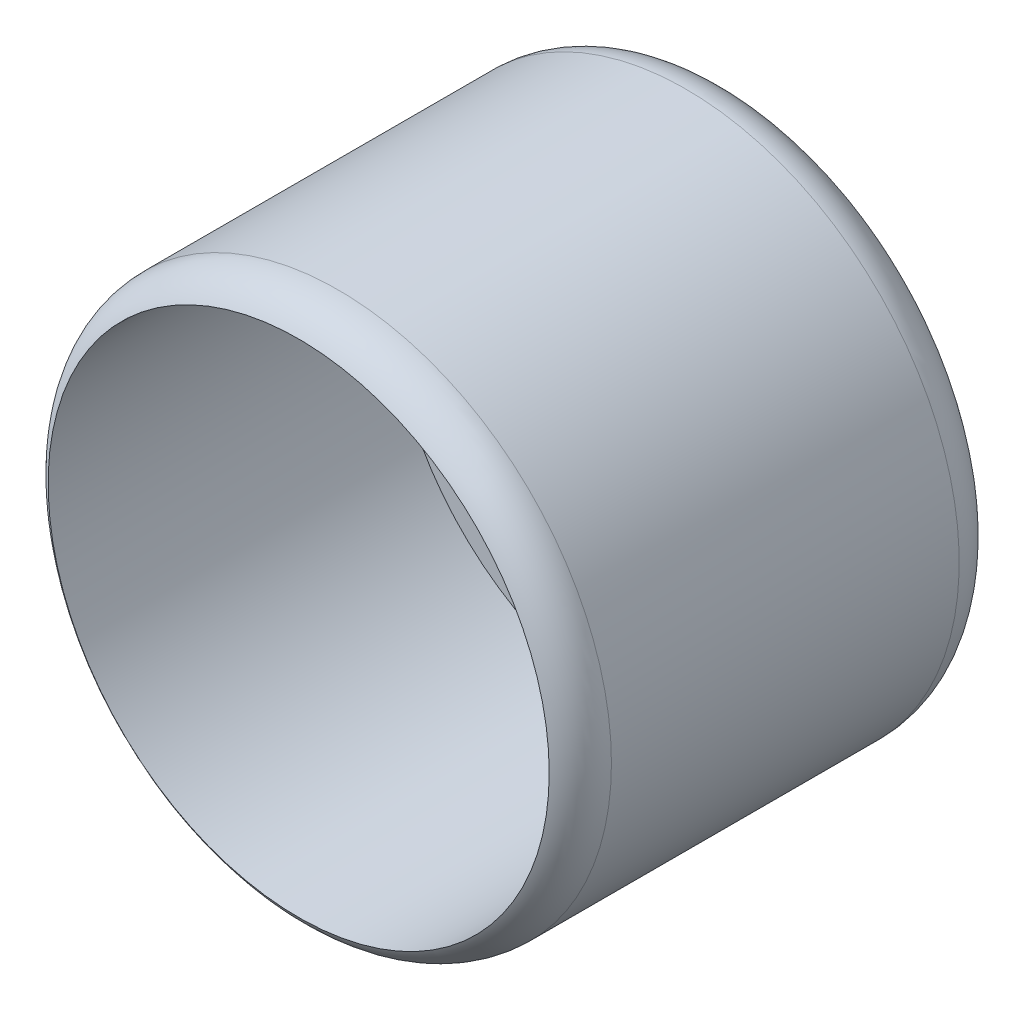
ISO-10303-21;
HEADER;
FILE_DESCRIPTION(('STEP AP214'),'2;1');
FILE_NAME('part.step','',(''),(''),'','','');
FILE_SCHEMA(('AUTOMOTIVE_DESIGN { 1 0 10303 214 1 1 1 1 }'));
ENDSEC;
DATA;
#1=APPLICATION_CONTEXT('core data for automotive mechanical design processes');
#2=APPLICATION_PROTOCOL_DEFINITION('international standard','automotive_design',2000,#1);
#3=PRODUCT_CONTEXT('',#1,'mechanical');
#4=PRODUCT('Part','Part','',(#3));
#5=PRODUCT_RELATED_PRODUCT_CATEGORY('part','',(#4));
#6=PRODUCT_DEFINITION_FORMATION('','',#4);
#7=PRODUCT_DEFINITION_CONTEXT('part definition',#1,'design');
#8=PRODUCT_DEFINITION('design','',#6,#7);
#9=PRODUCT_DEFINITION_SHAPE('','',#8);
#10=(LENGTH_UNIT() NAMED_UNIT(*) SI_UNIT(.MILLI.,.METRE.));
#11=(NAMED_UNIT(*) PLANE_ANGLE_UNIT() SI_UNIT($,.RADIAN.));
#12=(NAMED_UNIT(*) SI_UNIT($,.STERADIAN.) SOLID_ANGLE_UNIT());
#13=UNCERTAINTY_MEASURE_WITH_UNIT(LENGTH_MEASURE(1.E-05),#10,'distance_accuracy_value','');
#14=(GEOMETRIC_REPRESENTATION_CONTEXT(3) GLOBAL_UNCERTAINTY_ASSIGNED_CONTEXT((#13)) GLOBAL_UNIT_ASSIGNED_CONTEXT((#10,
#11,#12)) REPRESENTATION_CONTEXT('',''));
#15=CARTESIAN_POINT('',(0.,0.,0.));
#16=DIRECTION('',(0.,0.,1.));
#17=DIRECTION('',(1.,0.,0.));
#18=AXIS2_PLACEMENT_3D('',#15,#16,#17);
#19=CARTESIAN_POINT('',(0.,0.,-26.2311815808494));
#20=DIRECTION('',(0.,0.,-1.));
#21=DIRECTION('',(-1.,0.,0.));
#22=AXIS2_PLACEMENT_3D('',#19,#20,#21);
#23=CYLINDRICAL_SURFACE('',#22,4.375);
#24=CARTESIAN_POINT('',(0.,0.,-43.605550251614));
#25=DIRECTION('',(0.,0.,-1.));
#26=DIRECTION('',(-1.,0.,0.));
#27=AXIS2_PLACEMENT_3D('',#24,#25,#26);
#28=CIRCLE('',#27,4.375);
#29=CARTESIAN_POINT('',(-4.375,0.,-43.605550251614));
#30=VERTEX_POINT('',#29);
#31=EDGE_CURVE('E54',#30,#30,#28,.T.);
#32=ORIENTED_EDGE('',*,*,#31,.T.);
#33=EDGE_LOOP('',(#32));
#34=FACE_BOUND('',#33,.T.);
#35=CARTESIAN_POINT('',(0.,0.,-38.855550251614));
#36=DIRECTION('',(0.,0.,1.));
#37=DIRECTION('',(1.,0.,0.));
#38=AXIS2_PLACEMENT_3D('',#35,#36,#37);
#39=CIRCLE('',#38,4.375);
#40=CARTESIAN_POINT('',(4.37500000000001,0.,-38.855550251614));
#41=VERTEX_POINT('',#40);
#42=EDGE_CURVE('E51',#41,#41,#39,.F.);
#43=ORIENTED_EDGE('',*,*,#42,.F.);
#44=EDGE_LOOP('',(#43));
#45=FACE_BOUND('',#44,.T.);
#46=ADVANCED_FACE('F33',(#34,#45),#23,.F.);
#47=CARTESIAN_POINT('',(0.,0.,-19.855550251614));
#48=DIRECTION('',(0.,0.,-1.));
#49=DIRECTION('',(-1.,0.,0.));
#50=AXIS2_PLACEMENT_3D('',#47,#48,#49);
#51=CYLINDRICAL_SURFACE('',#50,15.);
#52=CARTESIAN_POINT('',(0.,0.,-22.0206137610751));
#53=DIRECTION('',(0.,0.,1.));
#54=DIRECTION('',(1.,0.,0.));
#55=AXIS2_PLACEMENT_3D('',#52,#53,#54);
#56=CIRCLE('',#55,15.);
#57=CARTESIAN_POINT('',(15.,0.,-22.0206137610751));
#58=VERTEX_POINT('',#57);
#59=EDGE_CURVE('E10',#58,#58,#56,.F.);
#60=ORIENTED_EDGE('',*,*,#59,.T.);
#61=EDGE_LOOP('',(#60));
#62=FACE_BOUND('',#61,.T.);
#63=CARTESIAN_POINT('',(0.,0.,-41.105550251614));
#64=DIRECTION('',(0.,0.,-1.));
#65=DIRECTION('',(-1.,0.,0.));
#66=AXIS2_PLACEMENT_3D('',#63,#64,#65);
#67=CIRCLE('',#66,15.);
#68=CARTESIAN_POINT('',(-15.,0.,-41.105550251614));
#69=VERTEX_POINT('',#68);
#70=EDGE_CURVE('E40',#69,#69,#67,.F.);
#71=ORIENTED_EDGE('',*,*,#70,.T.);
#72=EDGE_LOOP('',(#71));
#73=FACE_BOUND('',#72,.T.);
#74=ADVANCED_FACE('F88',(#62,#73),#51,.T.);
#75=CARTESIAN_POINT('',(0.,0.,-19.855550251614));
#76=DIRECTION('',(0.,0.,-1.));
#77=DIRECTION('',(-1.,0.,0.));
#78=AXIS2_PLACEMENT_3D('',#75,#76,#77);
#79=CYLINDRICAL_SURFACE('',#78,13.75);
#80=CARTESIAN_POINT('',(0.,0.,-19.855550251614));
#81=DIRECTION('',(0.,0.,1.));
#82=DIRECTION('',(1.,0.,0.));
#83=AXIS2_PLACEMENT_3D('',#80,#81,#82);
#84=CIRCLE('',#83,13.75);
#85=CARTESIAN_POINT('',(13.75,0.,-19.855550251614));
#86=VERTEX_POINT('',#85);
#87=EDGE_CURVE('E48',#86,#86,#84,.T.);
#88=ORIENTED_EDGE('',*,*,#87,.T.);
#89=EDGE_LOOP('',(#88));
#90=FACE_BOUND('',#89,.T.);
#91=CARTESIAN_POINT('',(0.,0.,-38.605550251614));
#92=DIRECTION('',(0.,0.,1.));
#93=DIRECTION('',(1.,0.,0.));
#94=AXIS2_PLACEMENT_3D('',#91,#92,#93);
#95=CIRCLE('',#94,13.75);
#96=CARTESIAN_POINT('',(13.75,0.,-38.605550251614));
#97=VERTEX_POINT('',#96);
#98=EDGE_CURVE('E58',#97,#97,#95,.T.);
#99=ORIENTED_EDGE('',*,*,#98,.F.);
#100=EDGE_LOOP('',(#99));
#101=FACE_BOUND('',#100,.T.);
#102=ADVANCED_FACE('F83',(#90,#101),#79,.F.);
#103=CARTESIAN_POINT('',(0.,0.,-38.605550251614));
#104=DIRECTION('',(0.,0.,1.));
#105=DIRECTION('',(1.,0.,0.));
#106=AXIS2_PLACEMENT_3D('',#103,#104,#105);
#107=PLANE('',#106);
#108=CARTESIAN_POINT('',(0.,0.,-38.605550251614));
#109=DIRECTION('',(0.,0.,1.));
#110=DIRECTION('',(1.,0.,0.));
#111=AXIS2_PLACEMENT_3D('',#108,#109,#110);
#112=CIRCLE('',#111,5.);
#113=CARTESIAN_POINT('',(5.00000000000001,0.,-38.605550251614));
#114=VERTEX_POINT('',#113);
#115=EDGE_CURVE('E63',#114,#114,#112,.T.);
#116=ORIENTED_EDGE('',*,*,#115,.F.);
#117=EDGE_LOOP('',(#116));
#118=FACE_BOUND('',#117,.T.);
#119=ORIENTED_EDGE('',*,*,#98,.T.);
#120=EDGE_LOOP('',(#119));
#121=FACE_BOUND('',#120,.T.);
#122=ADVANCED_FACE('F79',(#118,#121),#107,.T.);
#123=CARTESIAN_POINT('',(0.,0.,-43.605550251614));
#124=DIRECTION('',(0.,0.,-1.));
#125=DIRECTION('',(-1.,0.,0.));
#126=AXIS2_PLACEMENT_3D('',#123,#124,#125);
#127=PLANE('',#126);
#128=CARTESIAN_POINT('',(0.,0.,-43.605550251614));
#129=DIRECTION('',(0.,0.,-1.));
#130=DIRECTION('',(-1.,0.,0.));
#131=AXIS2_PLACEMENT_3D('',#128,#129,#130);
#132=CIRCLE('',#131,12.5);
#133=CARTESIAN_POINT('',(-12.5,0.,-43.605550251614));
#134=VERTEX_POINT('',#133);
#135=EDGE_CURVE('E44',#134,#134,#132,.T.);
#136=ORIENTED_EDGE('',*,*,#135,.T.);
#137=EDGE_LOOP('',(#136));
#138=FACE_BOUND('',#137,.T.);
#139=ORIENTED_EDGE('',*,*,#31,.F.);
#140=EDGE_LOOP('',(#139));
#141=FACE_BOUND('',#140,.T.);
#142=ADVANCED_FACE('F82',(#138,#141),#127,.T.);
#143=CARTESIAN_POINT('',(0.,0.,-38.855550251614));
#144=DIRECTION('',(0.,0.,1.));
#145=DIRECTION('',(1.,0.,0.));
#146=AXIS2_PLACEMENT_3D('',#143,#144,#145);
#147=PLANE('',#146);
#148=CARTESIAN_POINT('',(0.,0.,-38.855550251614));
#149=DIRECTION('',(0.,0.,1.));
#150=DIRECTION('',(1.,0.,0.));
#151=AXIS2_PLACEMENT_3D('',#148,#149,#150);
#152=CIRCLE('',#151,5.);
#153=CARTESIAN_POINT('',(5.00000000000001,0.,-38.855550251614));
#154=VERTEX_POINT('',#153);
#155=EDGE_CURVE('E55',#154,#154,#152,.T.);
#156=ORIENTED_EDGE('',*,*,#155,.T.);
#157=EDGE_LOOP('',(#156));
#158=FACE_BOUND('',#157,.T.);
#159=ORIENTED_EDGE('',*,*,#42,.T.);
#160=EDGE_LOOP('',(#159));
#161=FACE_BOUND('',#160,.T.);
#162=ADVANCED_FACE('F69',(#158,#161),#147,.T.);
#163=CARTESIAN_POINT('',(0.,0.,-38.855550251614));
#164=DIRECTION('',(0.,0.,1.));
#165=DIRECTION('',(1.,0.,0.));
#166=AXIS2_PLACEMENT_3D('',#163,#164,#165);
#167=CYLINDRICAL_SURFACE('',#166,5.);
#168=ORIENTED_EDGE('',*,*,#155,.F.);
#169=EDGE_LOOP('',(#168));
#170=FACE_BOUND('',#169,.T.);
#171=ORIENTED_EDGE('',*,*,#115,.T.);
#172=EDGE_LOOP('',(#171));
#173=FACE_BOUND('',#172,.T.);
#174=ADVANCED_FACE('F72',(#170,#173),#167,.F.);
#175=CARTESIAN_POINT('',(0.,0.,-41.105550251614));
#176=DIRECTION('',(0.,0.,-1.));
#177=DIRECTION('',(-1.,0.,0.));
#178=AXIS2_PLACEMENT_3D('',#175,#176,#177);
#179=TOROIDAL_SURFACE('',#178,12.5,2.5);
#180=ORIENTED_EDGE('',*,*,#70,.F.);
#181=EDGE_LOOP('',(#180));
#182=FACE_BOUND('',#181,.T.);
#183=ORIENTED_EDGE('',*,*,#135,.F.);
#184=EDGE_LOOP('',(#183));
#185=FACE_BOUND('',#184,.T.);
#186=ADVANCED_FACE('F75',(#182,#185),#179,.T.);
#187=CARTESIAN_POINT('',(0.,0.,-22.0206137610751));
#188=DIRECTION('',(0.,0.,1.));
#189=DIRECTION('',(1.,0.,0.));
#190=AXIS2_PLACEMENT_3D('',#187,#188,#189);
#191=TOROIDAL_SURFACE('',#190,12.5,2.5);
#192=ORIENTED_EDGE('',*,*,#59,.F.);
#193=EDGE_LOOP('',(#192));
#194=FACE_BOUND('',#193,.T.);
#195=ORIENTED_EDGE('',*,*,#87,.F.);
#196=EDGE_LOOP('',(#195));
#197=FACE_BOUND('',#196,.T.);
#198=ADVANCED_FACE('F35',(#194,#197),#191,.T.);
#199=CLOSED_SHELL('',(#46,#74,#102,#122,#142,#162,#174,#186,#198));
#200=MANIFOLD_SOLID_BREP('B2',#199);
#201=ADVANCED_BREP_SHAPE_REPRESENTATION('',(#18,#200),#14);
#202=SHAPE_DEFINITION_REPRESENTATION(#9,#201);
ENDSEC;
END-ISO-10303-21;
